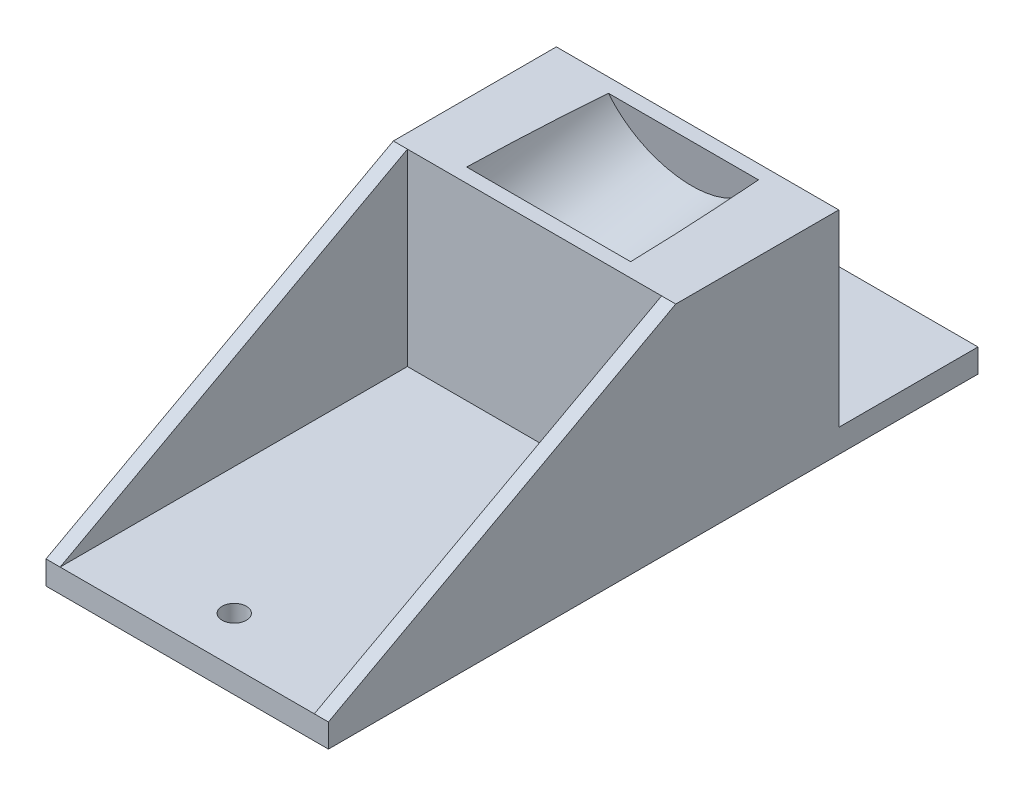
ISO-10303-21;
HEADER;
FILE_DESCRIPTION(('STEP AP214'),'2;1');
FILE_NAME('part.step','',(''),(''),'','','');
FILE_SCHEMA(('AUTOMOTIVE_DESIGN { 1 0 10303 214 1 1 1 1 }'));
ENDSEC;
DATA;
#1=APPLICATION_CONTEXT('core data for automotive mechanical design processes');
#2=APPLICATION_PROTOCOL_DEFINITION('international standard','automotive_design',2000,#1);
#3=PRODUCT_CONTEXT('',#1,'mechanical');
#4=PRODUCT('Part','Part','',(#3));
#5=PRODUCT_RELATED_PRODUCT_CATEGORY('part','',(#4));
#6=PRODUCT_DEFINITION_FORMATION('','',#4);
#7=PRODUCT_DEFINITION_CONTEXT('part definition',#1,'design');
#8=PRODUCT_DEFINITION('design','',#6,#7);
#9=PRODUCT_DEFINITION_SHAPE('','',#8);
#10=(LENGTH_UNIT() NAMED_UNIT(*) SI_UNIT(.MILLI.,.METRE.));
#11=(NAMED_UNIT(*) PLANE_ANGLE_UNIT() SI_UNIT($,.RADIAN.));
#12=(NAMED_UNIT(*) SI_UNIT($,.STERADIAN.) SOLID_ANGLE_UNIT());
#13=UNCERTAINTY_MEASURE_WITH_UNIT(LENGTH_MEASURE(1.E-05),#10,'distance_accuracy_value','');
#14=(GEOMETRIC_REPRESENTATION_CONTEXT(3) GLOBAL_UNCERTAINTY_ASSIGNED_CONTEXT((#13)) GLOBAL_UNIT_ASSIGNED_CONTEXT((#10,
#11,#12)) REPRESENTATION_CONTEXT('',''));
#15=CARTESIAN_POINT('',(0.,0.,0.));
#16=DIRECTION('',(0.,0.,1.));
#17=DIRECTION('',(1.,0.,0.));
#18=AXIS2_PLACEMENT_3D('',#15,#16,#17);
#19=CARTESIAN_POINT('',(-38.1000000000001,481.076,0.));
#20=DIRECTION('',(0.,-1.,0.));
#21=DIRECTION('',(1.,0.,0.));
#22=AXIS2_PLACEMENT_3D('',#19,#20,#21);
#23=PLANE('',#22);
#24=CARTESIAN_POINT('',(3.50460401440008E-13,481.076,703.961));
#25=DIRECTION('',(0.,-1.,0.));
#26=DIRECTION('',(1.,0.,0.));
#27=AXIS2_PLACEMENT_3D('',#24,#25,#26);
#28=CIRCLE('',#27,3.27659999999999);
#29=CARTESIAN_POINT('',(3.27660000000035,481.076,703.961));
#30=VERTEX_POINT('',#29);
#31=EDGE_CURVE('E252',#30,#30,#28,.T.);
#32=ORIENTED_EDGE('',*,*,#31,.T.);
#33=EDGE_LOOP('',(#32));
#34=FACE_BOUND('',#33,.T.);
#35=DIRECTION('',(0.,0.,-1.));
#36=VECTOR('',#35,1.);
#37=CARTESIAN_POINT('',(-34.29,481.076,0.));
#38=LINE('',#37,#36);
#39=CARTESIAN_POINT('',(-34.2900000000001,481.076,716.661));
#40=VERTEX_POINT('',#39);
#41=CARTESIAN_POINT('',(-34.2900000000001,481.076,622.952598243231));
#42=VERTEX_POINT('',#41);
#43=EDGE_CURVE('E161',#40,#42,#38,.T.);
#44=ORIENTED_EDGE('',*,*,#43,.F.);
#45=DIRECTION('',(-1.,0.,0.));
#46=VECTOR('',#45,1.);
#47=CARTESIAN_POINT('',(38.1000000000001,481.076,716.661));
#48=LINE('',#47,#46);
#49=CARTESIAN_POINT('',(34.2900000000001,481.076,716.661));
#50=VERTEX_POINT('',#49);
#51=EDGE_CURVE('E154',#50,#40,#48,.T.);
#52=ORIENTED_EDGE('',*,*,#51,.F.);
#53=DIRECTION('',(0.,0.,1.));
#54=VECTOR('',#53,1.);
#55=CARTESIAN_POINT('',(34.29,481.076,0.));
#56=LINE('',#55,#54);
#57=CARTESIAN_POINT('',(34.2900000000001,481.076,622.952598243231));
#58=VERTEX_POINT('',#57);
#59=EDGE_CURVE('E287',#58,#50,#56,.T.);
#60=ORIENTED_EDGE('',*,*,#59,.F.);
#61=DIRECTION('',(1.,0.,0.));
#62=VECTOR('',#61,1.);
#63=CARTESIAN_POINT('',(-38.1,481.076,622.952598243231));
#64=LINE('',#63,#62);
#65=EDGE_CURVE('E171',#42,#58,#64,.T.);
#66=ORIENTED_EDGE('',*,*,#65,.F.);
#67=EDGE_LOOP('',(#44,#52,#60,#66));
#68=FACE_BOUND('',#67,.T.);
#69=ADVANCED_FACE('F49',(#34,#68),#23,.F.);
#70=CARTESIAN_POINT('',(-38.1,0.,622.952598243231));
#71=DIRECTION('',(0.,0.,-1.));
#72=DIRECTION('',(-1.,0.,0.));
#73=AXIS2_PLACEMENT_3D('',#70,#71,#72);
#74=PLANE('',#73);
#75=DIRECTION('',(0.,1.,0.));
#76=VECTOR('',#75,1.);
#77=CARTESIAN_POINT('',(-34.29,0.,622.952598243231));
#78=LINE('',#77,#76);
#79=CARTESIAN_POINT('',(-34.2900000000001,531.876,622.952598243231));
#80=VERTEX_POINT('',#79);
#81=EDGE_CURVE('E163',#42,#80,#78,.T.);
#82=ORIENTED_EDGE('',*,*,#81,.F.);
#83=ORIENTED_EDGE('',*,*,#65,.T.);
#84=DIRECTION('',(0.,-1.,0.));
#85=VECTOR('',#84,1.);
#86=CARTESIAN_POINT('',(34.29,0.,622.952598243231));
#87=LINE('',#86,#85);
#88=CARTESIAN_POINT('',(34.2900000000001,531.876,622.952598243231));
#89=VERTEX_POINT('',#88);
#90=EDGE_CURVE('E291',#89,#58,#87,.T.);
#91=ORIENTED_EDGE('',*,*,#90,.F.);
#92=DIRECTION('',(1.,0.,0.));
#93=VECTOR('',#92,1.);
#94=CARTESIAN_POINT('',(-38.1,531.876,622.952598243231));
#95=LINE('',#94,#93);
#96=EDGE_CURVE('E204',#80,#89,#95,.T.);
#97=ORIENTED_EDGE('',*,*,#96,.F.);
#98=EDGE_LOOP('',(#82,#83,#91,#97));
#99=FACE_BOUND('',#98,.T.);
#100=ADVANCED_FACE('F306',(#99),#74,.F.);
#101=CARTESIAN_POINT('',(-38.1,531.876,564.261));
#102=DIRECTION('',(1.,0.,0.));
#103=DIRECTION('',(0.,0.,-1.));
#104=AXIS2_PLACEMENT_3D('',#101,#102,#103);
#105=PLANE('',#104);
#106=DIRECTION('',(0.,0.,1.));
#107=VECTOR('',#106,1.);
#108=CARTESIAN_POINT('',(-38.1,474.726,564.261));
#109=LINE('',#108,#107);
#110=CARTESIAN_POINT('',(-38.1,474.726,541.401));
#111=VERTEX_POINT('',#110);
#112=CARTESIAN_POINT('',(-38.1,474.726,716.661));
#113=VERTEX_POINT('',#112);
#114=EDGE_CURVE('E231',#111,#113,#109,.T.);
#115=ORIENTED_EDGE('',*,*,#114,.T.);
#116=DIRECTION('',(0.,-1.,0.));
#117=VECTOR('',#116,1.);
#118=CARTESIAN_POINT('',(-38.1,481.076,716.661));
#119=LINE('',#118,#117);
#120=CARTESIAN_POINT('',(-38.1,481.076,716.661));
#121=VERTEX_POINT('',#120);
#122=EDGE_CURVE('E178',#121,#113,#119,.T.);
#123=ORIENTED_EDGE('',*,*,#122,.F.);
#124=DIRECTION('',(0.,0.47658255787169,-0.879129720537576));
#125=VECTOR('',#124,1.);
#126=CARTESIAN_POINT('',(-38.1000000000001,481.076,716.661));
#127=LINE('',#126,#125);
#128=CARTESIAN_POINT('',(-38.1000000000001,531.876,622.952598243231));
#129=VERTEX_POINT('',#128);
#130=EDGE_CURVE('E148',#121,#129,#127,.T.);
#131=ORIENTED_EDGE('',*,*,#130,.T.);
#132=DIRECTION('',(0.,0.,1.));
#133=VECTOR('',#132,1.);
#134=CARTESIAN_POINT('',(-38.1,531.876,564.261));
#135=LINE('',#134,#133);
#136=CARTESIAN_POINT('',(-38.1,531.876,578.966109565155));
#137=VERTEX_POINT('',#136);
#138=EDGE_CURVE('E232',#137,#129,#135,.T.);
#139=ORIENTED_EDGE('',*,*,#138,.F.);
#140=DIRECTION('',(0.,-1.,0.));
#141=VECTOR('',#140,1.);
#142=CARTESIAN_POINT('',(-38.1,0.,578.966109565155));
#143=LINE('',#142,#141);
#144=CARTESIAN_POINT('',(-38.1,481.076,578.966109565155));
#145=VERTEX_POINT('',#144);
#146=EDGE_CURVE('E75',#137,#145,#143,.T.);
#147=ORIENTED_EDGE('',*,*,#146,.T.);
#148=DIRECTION('',(0.,0.,1.));
#149=VECTOR('',#148,1.);
#150=CARTESIAN_POINT('',(-38.1000000000001,481.076,0.));
#151=LINE('',#150,#149);
#152=CARTESIAN_POINT('',(-38.1,481.076,541.401));
#153=VERTEX_POINT('',#152);
#154=EDGE_CURVE('E210',#153,#145,#151,.T.);
#155=ORIENTED_EDGE('',*,*,#154,.F.);
#156=DIRECTION('',(0.,1.,0.));
#157=VECTOR('',#156,1.);
#158=CARTESIAN_POINT('',(-38.1,474.726,541.401));
#159=LINE('',#158,#157);
#160=EDGE_CURVE('E184',#111,#153,#159,.T.);
#161=ORIENTED_EDGE('',*,*,#160,.F.);
#162=EDGE_LOOP('',(#115,#123,#131,#139,#147,#155,#161));
#163=FACE_BOUND('',#162,.T.);
#164=ADVANCED_FACE('F51',(#163),#105,.F.);
#165=CARTESIAN_POINT('',(38.1000000000001,531.876,564.261));
#166=DIRECTION('',(-1.,0.,0.));
#167=DIRECTION('',(0.,0.,1.));
#168=AXIS2_PLACEMENT_3D('',#165,#166,#167);
#169=PLANE('',#168);
#170=DIRECTION('',(0.,0.,-1.));
#171=VECTOR('',#170,1.);
#172=CARTESIAN_POINT('',(38.1000000000001,531.876,564.261));
#173=LINE('',#172,#171);
#174=CARTESIAN_POINT('',(38.1000000000001,531.876,622.952598243231));
#175=VERTEX_POINT('',#174);
#176=CARTESIAN_POINT('',(38.1000000000001,531.876,578.966109565155));
#177=VERTEX_POINT('',#176);
#178=EDGE_CURVE('E236',#175,#177,#173,.T.);
#179=ORIENTED_EDGE('',*,*,#178,.F.);
#180=DIRECTION('',(0.,0.47658255787169,-0.879129720537576));
#181=VECTOR('',#180,1.);
#182=CARTESIAN_POINT('',(38.1000000000001,481.076,716.661));
#183=LINE('',#182,#181);
#184=CARTESIAN_POINT('',(38.1000000000001,481.076,716.661));
#185=VERTEX_POINT('',#184);
#186=EDGE_CURVE('E283',#185,#175,#183,.T.);
#187=ORIENTED_EDGE('',*,*,#186,.F.);
#188=DIRECTION('',(0.,1.,0.));
#189=VECTOR('',#188,1.);
#190=CARTESIAN_POINT('',(38.1000000000001,474.726,716.661));
#191=LINE('',#190,#189);
#192=CARTESIAN_POINT('',(38.1000000000001,474.726,716.661));
#193=VERTEX_POINT('',#192);
#194=EDGE_CURVE('E155',#193,#185,#191,.T.);
#195=ORIENTED_EDGE('',*,*,#194,.F.);
#196=DIRECTION('',(0.,0.,-1.));
#197=VECTOR('',#196,1.);
#198=CARTESIAN_POINT('',(38.1,474.726,564.261));
#199=LINE('',#198,#197);
#200=CARTESIAN_POINT('',(38.1,474.726,541.401));
#201=VERTEX_POINT('',#200);
#202=EDGE_CURVE('E237',#193,#201,#199,.T.);
#203=ORIENTED_EDGE('',*,*,#202,.T.);
#204=DIRECTION('',(0.,-1.,0.));
#205=VECTOR('',#204,1.);
#206=CARTESIAN_POINT('',(38.1000000000001,481.076,541.401));
#207=LINE('',#206,#205);
#208=CARTESIAN_POINT('',(38.1000000000001,481.076,541.401));
#209=VERTEX_POINT('',#208);
#210=EDGE_CURVE('E191',#209,#201,#207,.T.);
#211=ORIENTED_EDGE('',*,*,#210,.F.);
#212=DIRECTION('',(0.,0.,1.));
#213=VECTOR('',#212,1.);
#214=CARTESIAN_POINT('',(38.1,481.076,0.));
#215=LINE('',#214,#213);
#216=CARTESIAN_POINT('',(38.1000000000001,481.076,578.966109565155));
#217=VERTEX_POINT('',#216);
#218=EDGE_CURVE('E211',#209,#217,#215,.T.);
#219=ORIENTED_EDGE('',*,*,#218,.T.);
#220=DIRECTION('',(0.,-1.,0.));
#221=VECTOR('',#220,1.);
#222=CARTESIAN_POINT('',(38.1,0.,578.966109565155));
#223=LINE('',#222,#221);
#224=EDGE_CURVE('E198',#177,#217,#223,.T.);
#225=ORIENTED_EDGE('',*,*,#224,.F.);
#226=EDGE_LOOP('',(#179,#187,#195,#203,#211,#219,#225));
#227=FACE_BOUND('',#226,.T.);
#228=ADVANCED_FACE('F281',(#227),#169,.F.);
#229=CARTESIAN_POINT('',(3.50513413540524E-13,531.876,0.));
#230=DIRECTION('',(0.,1.,0.));
#231=DIRECTION('',(-1.,0.,0.));
#232=AXIS2_PLACEMENT_3D('',#229,#230,#231);
#233=PLANE('',#232);
#234=EDGE_CURVE('E199',#129,#80,#95,.T.);
#235=ORIENTED_EDGE('',*,*,#234,.T.);
#236=ORIENTED_EDGE('',*,*,#96,.T.);
#237=DIRECTION('',(-1.,0.,0.));
#238=VECTOR('',#237,1.);
#239=CARTESIAN_POINT('',(-38.1,531.876,622.952598243231));
#240=LINE('',#239,#238);
#241=EDGE_CURVE('E269',#89,#175,#240,.F.);
#242=ORIENTED_EDGE('',*,*,#241,.T.);
#243=ORIENTED_EDGE('',*,*,#178,.T.);
#244=DIRECTION('',(1.,0.,0.));
#245=VECTOR('',#244,1.);
#246=CARTESIAN_POINT('',(-38.1,531.876,578.966109565155));
#247=LINE('',#246,#245);
#248=EDGE_CURVE('E214',#137,#177,#247,.T.);
#249=ORIENTED_EDGE('',*,*,#248,.F.);
#250=ORIENTED_EDGE('',*,*,#138,.T.);
#251=EDGE_LOOP('',(#235,#236,#242,#243,#249,#250));
#252=FACE_BOUND('',#251,.T.);
#253=DIRECTION('',(-1.,0.,0.));
#254=VECTOR('',#253,1.);
#255=CARTESIAN_POINT('',(-1.2984548798011E-12,531.876,582.776109565155));
#256=LINE('',#255,#254);
#257=CARTESIAN_POINT('',(20.2281209370479,531.876,582.776109565155));
#258=VERTEX_POINT('',#257);
#259=CARTESIAN_POINT('',(-20.2281209370508,531.876,582.776109565154));
#260=VERTEX_POINT('',#259);
#261=EDGE_CURVE('E11',#258,#260,#256,.T.);
#262=ORIENTED_EDGE('',*,*,#261,.F.);
#263=CARTESIAN_POINT('',(-1.64024956406216E-12,531.876,637.540480971223));
#264=DIRECTION('',(0.,1.,0.));
#265=DIRECTION('',(0.,0.,1.));
#266=AXIS2_PLACEMENT_3D('',#263,#264,#265);
#267=ELLIPSE('',#266,128.720037839212,22.3519999999999);
#268=CARTESIAN_POINT('',(22.1225093548292,531.876,619.142598243231));
#269=VERTEX_POINT('',#268);
#270=EDGE_CURVE('E249',#258,#269,#267,.F.);
#271=ORIENTED_EDGE('',*,*,#270,.T.);
#272=DIRECTION('',(-1.,0.,0.));
#273=VECTOR('',#272,1.);
#274=CARTESIAN_POINT('',(-1.40135406490164E-12,531.876,619.142598243231));
#275=LINE('',#274,#273);
#276=CARTESIAN_POINT('',(-22.1225093548324,531.876,619.142598243231));
#277=VERTEX_POINT('',#276);
#278=EDGE_CURVE('E241',#269,#277,#275,.T.);
#279=ORIENTED_EDGE('',*,*,#278,.T.);
#280=EDGE_CURVE('E59',#277,#260,#267,.F.);
#281=ORIENTED_EDGE('',*,*,#280,.T.);
#282=EDGE_LOOP('',(#262,#271,#279,#281));
#283=FACE_BOUND('',#282,.T.);
#284=ADVANCED_FACE('F301',(#252,#283),#233,.T.);
#285=CARTESIAN_POINT('',(3.45834472170736E-13,474.726,0.));
#286=DIRECTION('',(0.,1.,0.));
#287=DIRECTION('',(-1.,0.,0.));
#288=AXIS2_PLACEMENT_3D('',#285,#286,#287);
#289=PLANE('',#288);
#290=ORIENTED_EDGE('',*,*,#114,.F.);
#291=DIRECTION('',(-1.,0.,0.));
#292=VECTOR('',#291,1.);
#293=CARTESIAN_POINT('',(38.1,474.726,541.401));
#294=LINE('',#293,#292);
#295=EDGE_CURVE('E195',#201,#111,#294,.T.);
#296=ORIENTED_EDGE('',*,*,#295,.F.);
#297=ORIENTED_EDGE('',*,*,#202,.F.);
#298=DIRECTION('',(1.,0.,0.));
#299=VECTOR('',#298,1.);
#300=CARTESIAN_POINT('',(-38.1,474.726,716.661));
#301=LINE('',#300,#299);
#302=EDGE_CURVE('E261',#113,#193,#301,.T.);
#303=ORIENTED_EDGE('',*,*,#302,.F.);
#304=EDGE_LOOP('',(#290,#296,#297,#303));
#305=FACE_BOUND('',#304,.T.);
#306=CARTESIAN_POINT('',(3.45834472170736E-13,474.726,703.961));
#307=DIRECTION('',(0.,-1.,0.));
#308=DIRECTION('',(1.,0.,0.));
#309=AXIS2_PLACEMENT_3D('',#306,#307,#308);
#310=CIRCLE('',#309,3.27659999999999);
#311=CARTESIAN_POINT('',(3.27660000000034,474.726,703.961));
#312=VERTEX_POINT('',#311);
#313=EDGE_CURVE('E255',#312,#312,#310,.T.);
#314=ORIENTED_EDGE('',*,*,#313,.F.);
#315=EDGE_LOOP('',(#314));
#316=FACE_BOUND('',#315,.T.);
#317=CARTESIAN_POINT('',(3.45834472170736E-13,474.726,551.561));
#318=DIRECTION('',(0.,-1.,0.));
#319=DIRECTION('',(1.,0.,0.));
#320=AXIS2_PLACEMENT_3D('',#317,#318,#319);
#321=CIRCLE('',#320,3.2766);
#322=CARTESIAN_POINT('',(3.27660000000034,474.726,551.561));
#323=VERTEX_POINT('',#322);
#324=EDGE_CURVE('E263',#323,#323,#321,.T.);
#325=ORIENTED_EDGE('',*,*,#324,.F.);
#326=EDGE_LOOP('',(#325));
#327=FACE_BOUND('',#326,.T.);
#328=ADVANCED_FACE('F324',(#305,#316,#327),#289,.F.);
#329=CARTESIAN_POINT('',(-1.48314344017181E-12,541.241259078723,584.427457422059));
#330=DIRECTION('',(0.,-0.17364817766695,0.984807753012205));
#331=DIRECTION('',(0.,-0.984807753012205,-0.17364817766695));
#332=AXIS2_PLACEMENT_3D('',#329,#330,#331);
#333=CYLINDRICAL_SURFACE('',#332,22.3519999999999);
#334=CARTESIAN_POINT('',(-1.58747035800222E-12,535.022223243759,619.697362288437));
#335=DIRECTION('',(0.,0.17364817766695,-0.984807753012205));
#336=DIRECTION('',(0.,0.984807753012205,0.17364817766695));
#337=AXIS2_PLACEMENT_3D('',#334,#335,#336);
#338=CIRCLE('',#337,22.3519999999999);
#339=EDGE_CURVE('E203',#269,#277,#338,.T.);
#340=ORIENTED_EDGE('',*,*,#339,.F.);
#341=ORIENTED_EDGE('',*,*,#270,.F.);
#342=CARTESIAN_POINT('',(-1.48314344017181E-12,541.241259078723,584.427457422059));
#343=DIRECTION('',(0.,0.17364817766695,-0.984807753012205));
#344=DIRECTION('',(0.,0.984807753012205,0.17364817766695));
#345=AXIS2_PLACEMENT_3D('',#342,#343,#344);
#346=CIRCLE('',#345,22.3519999999999);
#347=EDGE_CURVE('E227',#258,#260,#346,.T.);
#348=ORIENTED_EDGE('',*,*,#347,.T.);
#349=ORIENTED_EDGE('',*,*,#280,.F.);
#350=EDGE_LOOP('',(#340,#341,#348,#349));
#351=FACE_BOUND('',#350,.T.);
#352=ADVANCED_FACE('F327',(#351),#333,.F.);
#353=CARTESIAN_POINT('',(-1.48314344017181E-12,541.241259078723,584.427457422059));
#354=DIRECTION('',(0.,0.17364817766695,-0.984807753012205));
#355=DIRECTION('',(0.,0.984807753012205,0.17364817766695));
#356=AXIS2_PLACEMENT_3D('',#353,#354,#355);
#357=PLANE('',#356);
#358=ORIENTED_EDGE('',*,*,#261,.T.);
#359=ORIENTED_EDGE('',*,*,#347,.F.);
#360=EDGE_LOOP('',(#358,#359));
#361=FACE_BOUND('',#360,.T.);
#362=ADVANCED_FACE('F361',(#361),#357,.F.);
#363=CARTESIAN_POINT('',(-1.58747035800222E-12,535.022223243759,619.697362288437));
#364=DIRECTION('',(0.,0.17364817766695,-0.984807753012205));
#365=DIRECTION('',(0.,0.984807753012205,0.17364817766695));
#366=AXIS2_PLACEMENT_3D('',#363,#364,#365);
#367=PLANE('',#366);
#368=ORIENTED_EDGE('',*,*,#339,.T.);
#369=ORIENTED_EDGE('',*,*,#278,.F.);
#370=EDGE_LOOP('',(#368,#369));
#371=FACE_BOUND('',#370,.T.);
#372=ADVANCED_FACE('F356',(#371),#367,.T.);
#373=CARTESIAN_POINT('',(-38.1000000000001,481.076,0.));
#374=DIRECTION('',(0.,1.,0.));
#375=DIRECTION('',(-1.,0.,0.));
#376=AXIS2_PLACEMENT_3D('',#373,#374,#375);
#377=PLANE('',#376);
#378=DIRECTION('',(1.,0.,0.));
#379=VECTOR('',#378,1.);
#380=CARTESIAN_POINT('',(-38.1,481.076,578.966109565155));
#381=LINE('',#380,#379);
#382=EDGE_CURVE('E207',#145,#217,#381,.T.);
#383=ORIENTED_EDGE('',*,*,#382,.T.);
#384=ORIENTED_EDGE('',*,*,#218,.F.);
#385=DIRECTION('',(1.,0.,0.));
#386=VECTOR('',#385,1.);
#387=CARTESIAN_POINT('',(-38.1,481.076,541.401));
#388=LINE('',#387,#386);
#389=EDGE_CURVE('E188',#153,#209,#388,.T.);
#390=ORIENTED_EDGE('',*,*,#389,.F.);
#391=ORIENTED_EDGE('',*,*,#154,.T.);
#392=EDGE_LOOP('',(#383,#384,#390,#391));
#393=FACE_BOUND('',#392,.T.);
#394=CARTESIAN_POINT('',(3.50460401440008E-13,481.076,551.561));
#395=DIRECTION('',(0.,1.,0.));
#396=DIRECTION('',(-1.,0.,0.));
#397=AXIS2_PLACEMENT_3D('',#394,#395,#396);
#398=CIRCLE('',#397,3.2766);
#399=CARTESIAN_POINT('',(-3.27659999999965,481.076,551.561));
#400=VERTEX_POINT('',#399);
#401=EDGE_CURVE('E53',#400,#400,#398,.T.);
#402=ORIENTED_EDGE('',*,*,#401,.F.);
#403=EDGE_LOOP('',(#402));
#404=FACE_BOUND('',#403,.T.);
#405=ADVANCED_FACE('F316',(#393,#404),#377,.T.);
#406=CARTESIAN_POINT('',(-38.1,0.,578.966109565155));
#407=DIRECTION('',(0.,0.,1.));
#408=DIRECTION('',(1.,0.,0.));
#409=AXIS2_PLACEMENT_3D('',#406,#407,#408);
#410=PLANE('',#409);
#411=ORIENTED_EDGE('',*,*,#248,.T.);
#412=ORIENTED_EDGE('',*,*,#224,.T.);
#413=ORIENTED_EDGE('',*,*,#382,.F.);
#414=ORIENTED_EDGE('',*,*,#146,.F.);
#415=EDGE_LOOP('',(#411,#412,#413,#414));
#416=FACE_BOUND('',#415,.T.);
#417=ADVANCED_FACE('F312',(#416),#410,.F.);
#418=CARTESIAN_POINT('',(0.,0.,541.401));
#419=DIRECTION('',(0.,0.,-1.));
#420=DIRECTION('',(-1.,0.,0.));
#421=AXIS2_PLACEMENT_3D('',#418,#419,#420);
#422=PLANE('',#421);
#423=ORIENTED_EDGE('',*,*,#389,.T.);
#424=ORIENTED_EDGE('',*,*,#210,.T.);
#425=ORIENTED_EDGE('',*,*,#295,.T.);
#426=ORIENTED_EDGE('',*,*,#160,.T.);
#427=EDGE_LOOP('',(#423,#424,#425,#426));
#428=FACE_BOUND('',#427,.T.);
#429=ADVANCED_FACE('F321',(#428),#422,.T.);
#430=CARTESIAN_POINT('',(0.,0.,716.661));
#431=DIRECTION('',(0.,0.,1.));
#432=DIRECTION('',(1.,0.,0.));
#433=AXIS2_PLACEMENT_3D('',#430,#431,#432);
#434=PLANE('',#433);
#435=ORIENTED_EDGE('',*,*,#302,.T.);
#436=ORIENTED_EDGE('',*,*,#194,.T.);
#437=EDGE_CURVE('E157',#185,#50,#48,.T.);
#438=ORIENTED_EDGE('',*,*,#437,.T.);
#439=ORIENTED_EDGE('',*,*,#51,.T.);
#440=EDGE_CURVE('E142',#40,#121,#48,.T.);
#441=ORIENTED_EDGE('',*,*,#440,.T.);
#442=ORIENTED_EDGE('',*,*,#122,.T.);
#443=EDGE_LOOP('',(#435,#436,#438,#439,#441,#442));
#444=FACE_BOUND('',#443,.T.);
#445=ADVANCED_FACE('F174',(#444),#434,.T.);
#446=CARTESIAN_POINT('',(3.8746783559418E-13,531.876,703.961));
#447=DIRECTION('',(0.,-1.,0.));
#448=DIRECTION('',(1.,0.,0.));
#449=AXIS2_PLACEMENT_3D('',#446,#447,#448);
#450=CYLINDRICAL_SURFACE('',#449,3.27659999999999);
#451=ORIENTED_EDGE('',*,*,#313,.T.);
#452=EDGE_LOOP('',(#451));
#453=FACE_BOUND('',#452,.T.);
#454=ORIENTED_EDGE('',*,*,#31,.F.);
#455=EDGE_LOOP('',(#454));
#456=FACE_BOUND('',#455,.T.);
#457=ADVANCED_FACE('F334',(#453,#456),#450,.F.);
#458=CARTESIAN_POINT('',(3.8746783559418E-13,531.876,551.561));
#459=DIRECTION('',(0.,-1.,0.));
#460=DIRECTION('',(1.,0.,0.));
#461=AXIS2_PLACEMENT_3D('',#458,#459,#460);
#462=CYLINDRICAL_SURFACE('',#461,3.2766);
#463=ORIENTED_EDGE('',*,*,#401,.T.);
#464=EDGE_LOOP('',(#463));
#465=FACE_BOUND('',#464,.T.);
#466=ORIENTED_EDGE('',*,*,#324,.T.);
#467=EDGE_LOOP('',(#466));
#468=FACE_BOUND('',#467,.T.);
#469=ADVANCED_FACE('F332',(#465,#468),#462,.F.);
#470=CARTESIAN_POINT('',(38.1000000000001,481.076,716.661));
#471=DIRECTION('',(0.,-0.879129720537576,-0.47658255787169));
#472=DIRECTION('',(0.,0.47658255787169,-0.879129720537576));
#473=AXIS2_PLACEMENT_3D('',#470,#471,#472);
#474=PLANE('',#473);
#475=ORIENTED_EDGE('',*,*,#241,.F.);
#476=DIRECTION('',(0.,0.47658255787169,-0.879129720537576));
#477=VECTOR('',#476,1.);
#478=CARTESIAN_POINT('',(34.2900000000001,481.076,716.661));
#479=LINE('',#478,#477);
#480=EDGE_CURVE('E67',#50,#89,#479,.T.);
#481=ORIENTED_EDGE('',*,*,#480,.F.);
#482=ORIENTED_EDGE('',*,*,#437,.F.);
#483=ORIENTED_EDGE('',*,*,#186,.T.);
#484=EDGE_LOOP('',(#475,#481,#482,#483));
#485=FACE_BOUND('',#484,.T.);
#486=ADVANCED_FACE('F303',(#485),#474,.F.);
#487=CARTESIAN_POINT('',(34.29,503.301,629.031));
#488=DIRECTION('',(1.,0.,0.));
#489=DIRECTION('',(0.,0.,-1.));
#490=AXIS2_PLACEMENT_3D('',#487,#488,#489);
#491=PLANE('',#490);
#492=ORIENTED_EDGE('',*,*,#480,.T.);
#493=ORIENTED_EDGE('',*,*,#90,.T.);
#494=ORIENTED_EDGE('',*,*,#59,.T.);
#495=EDGE_LOOP('',(#492,#493,#494));
#496=FACE_BOUND('',#495,.T.);
#497=ADVANCED_FACE('F304',(#496),#491,.F.);
#498=CARTESIAN_POINT('',(-38.1000000000001,481.076,716.661));
#499=DIRECTION('',(0.,0.879129720537576,0.47658255787169));
#500=DIRECTION('',(0.,0.47658255787169,-0.879129720537576));
#501=AXIS2_PLACEMENT_3D('',#498,#499,#500);
#502=PLANE('',#501);
#503=ORIENTED_EDGE('',*,*,#234,.F.);
#504=ORIENTED_EDGE('',*,*,#130,.F.);
#505=ORIENTED_EDGE('',*,*,#440,.F.);
#506=DIRECTION('',(0.,0.47658255787169,-0.879129720537576));
#507=VECTOR('',#506,1.);
#508=CARTESIAN_POINT('',(-34.2900000000001,481.076,716.661));
#509=LINE('',#508,#507);
#510=EDGE_CURVE('E145',#40,#80,#509,.T.);
#511=ORIENTED_EDGE('',*,*,#510,.T.);
#512=EDGE_LOOP('',(#503,#504,#505,#511));
#513=FACE_BOUND('',#512,.T.);
#514=ADVANCED_FACE('F144',(#513),#502,.T.);
#515=CARTESIAN_POINT('',(-34.2900000000001,503.301,629.031));
#516=DIRECTION('',(-1.,0.,0.));
#517=DIRECTION('',(0.,0.,1.));
#518=AXIS2_PLACEMENT_3D('',#515,#516,#517);
#519=PLANE('',#518);
#520=ORIENTED_EDGE('',*,*,#43,.T.);
#521=ORIENTED_EDGE('',*,*,#81,.T.);
#522=ORIENTED_EDGE('',*,*,#510,.F.);
#523=EDGE_LOOP('',(#520,#521,#522));
#524=FACE_BOUND('',#523,.T.);
#525=ADVANCED_FACE('F160',(#524),#519,.F.);
#526=CLOSED_SHELL('',(#69,#100,#164,#228,#284,#328,#352,#362,#372,#405,#417,#429,#445,#457,#469,
#486,#497,#514,#525));
#527=MANIFOLD_SOLID_BREP('B2',#526);
#528=ADVANCED_BREP_SHAPE_REPRESENTATION('',(#18,#527),#14);
#529=SHAPE_DEFINITION_REPRESENTATION(#9,#528);
ENDSEC;
END-ISO-10303-21;
